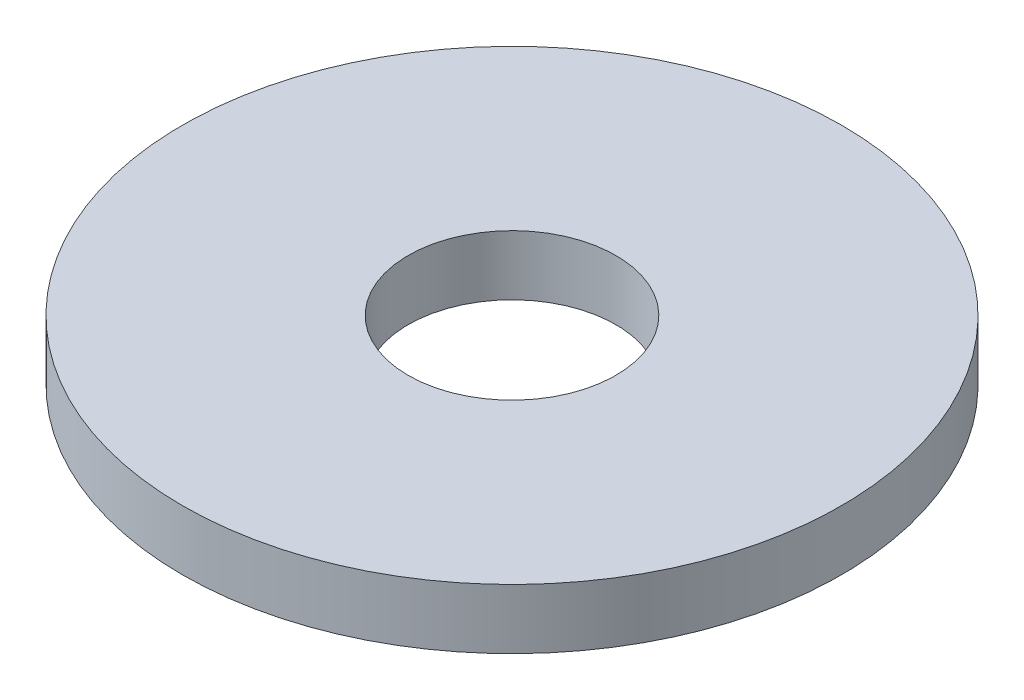
ISO-10303-21;
HEADER;
FILE_DESCRIPTION(('STEP AP214'),'2;1');
FILE_NAME('part.step','',(''),(''),'','','');
FILE_SCHEMA(('AUTOMOTIVE_DESIGN { 1 0 10303 214 1 1 1 1 }'));
ENDSEC;
DATA;
#1=APPLICATION_CONTEXT('core data for automotive mechanical design processes');
#2=APPLICATION_PROTOCOL_DEFINITION('international standard','automotive_design',2000,#1);
#3=PRODUCT_CONTEXT('',#1,'mechanical');
#4=PRODUCT('Part','Part','',(#3));
#5=PRODUCT_RELATED_PRODUCT_CATEGORY('part','',(#4));
#6=PRODUCT_DEFINITION_FORMATION('','',#4);
#7=PRODUCT_DEFINITION_CONTEXT('part definition',#1,'design');
#8=PRODUCT_DEFINITION('design','',#6,#7);
#9=PRODUCT_DEFINITION_SHAPE('','',#8);
#10=(LENGTH_UNIT() NAMED_UNIT(*) SI_UNIT(.MILLI.,.METRE.));
#11=(NAMED_UNIT(*) PLANE_ANGLE_UNIT() SI_UNIT($,.RADIAN.));
#12=(NAMED_UNIT(*) SI_UNIT($,.STERADIAN.) SOLID_ANGLE_UNIT());
#13=UNCERTAINTY_MEASURE_WITH_UNIT(LENGTH_MEASURE(1.E-05),#10,'distance_accuracy_value','');
#14=(GEOMETRIC_REPRESENTATION_CONTEXT(3) GLOBAL_UNCERTAINTY_ASSIGNED_CONTEXT((#13)) GLOBAL_UNIT_ASSIGNED_CONTEXT((#10,
#11,#12)) REPRESENTATION_CONTEXT('',''));
#15=CARTESIAN_POINT('',(0.,0.,0.));
#16=DIRECTION('',(0.,0.,1.));
#17=DIRECTION('',(1.,0.,0.));
#18=AXIS2_PLACEMENT_3D('',#15,#16,#17);
#19=CARTESIAN_POINT('',(0.,1.5,0.));
#20=DIRECTION('',(0.,1.,0.));
#21=DIRECTION('',(0.,0.,1.));
#22=AXIS2_PLACEMENT_3D('',#19,#20,#21);
#23=PLANE('',#22);
#24=CARTESIAN_POINT('',(0.,1.5,0.));
#25=DIRECTION('',(0.,1.,0.));
#26=DIRECTION('',(0.,0.,1.));
#27=AXIS2_PLACEMENT_3D('',#24,#25,#26);
#28=CIRCLE('',#27,8.25);
#29=CARTESIAN_POINT('',(0.,1.5,8.25));
#30=VERTEX_POINT('',#29);
#31=EDGE_CURVE('E11',#30,#30,#28,.T.);
#32=ORIENTED_EDGE('',*,*,#31,.T.);
#33=EDGE_LOOP('',(#32));
#34=FACE_BOUND('',#33,.T.);
#35=CARTESIAN_POINT('',(0.,1.5,0.));
#36=DIRECTION('',(0.,1.,0.));
#37=DIRECTION('',(0.,0.,1.));
#38=AXIS2_PLACEMENT_3D('',#35,#36,#37);
#39=CIRCLE('',#38,2.6);
#40=CARTESIAN_POINT('',(0.,1.5,2.6));
#41=VERTEX_POINT('',#40);
#42=EDGE_CURVE('E56',#41,#41,#39,.T.);
#43=ORIENTED_EDGE('',*,*,#42,.F.);
#44=EDGE_LOOP('',(#43));
#45=FACE_BOUND('',#44,.T.);
#46=ADVANCED_FACE('F43',(#34,#45),#23,.T.);
#47=CARTESIAN_POINT('',(0.,0.,0.));
#48=DIRECTION('',(0.,1.,0.));
#49=DIRECTION('',(0.,0.,1.));
#50=AXIS2_PLACEMENT_3D('',#47,#48,#49);
#51=PLANE('',#50);
#52=CARTESIAN_POINT('',(0.,0.,0.));
#53=DIRECTION('',(0.,1.,0.));
#54=DIRECTION('',(0.,0.,1.));
#55=AXIS2_PLACEMENT_3D('',#52,#53,#54);
#56=CIRCLE('',#55,8.25);
#57=CARTESIAN_POINT('',(0.,0.,8.25));
#58=VERTEX_POINT('',#57);
#59=EDGE_CURVE('E47',#58,#58,#56,.T.);
#60=ORIENTED_EDGE('',*,*,#59,.F.);
#61=EDGE_LOOP('',(#60));
#62=FACE_BOUND('',#61,.T.);
#63=CARTESIAN_POINT('',(0.,0.,0.));
#64=DIRECTION('',(0.,1.,0.));
#65=DIRECTION('',(0.,0.,1.));
#66=AXIS2_PLACEMENT_3D('',#63,#64,#65);
#67=CIRCLE('',#66,2.6);
#68=CARTESIAN_POINT('',(0.,0.,2.6));
#69=VERTEX_POINT('',#68);
#70=EDGE_CURVE('E58',#69,#69,#67,.T.);
#71=ORIENTED_EDGE('',*,*,#70,.T.);
#72=EDGE_LOOP('',(#71));
#73=FACE_BOUND('',#72,.T.);
#74=ADVANCED_FACE('F70',(#62,#73),#51,.F.);
#75=CARTESIAN_POINT('',(0.,1.5,0.));
#76=DIRECTION('',(0.,-1.,0.));
#77=DIRECTION('',(0.,0.,-1.));
#78=AXIS2_PLACEMENT_3D('',#75,#76,#77);
#79=CYLINDRICAL_SURFACE('',#78,8.25);
#80=ORIENTED_EDGE('',*,*,#31,.F.);
#81=EDGE_LOOP('',(#80));
#82=FACE_BOUND('',#81,.T.);
#83=ORIENTED_EDGE('',*,*,#59,.T.);
#84=EDGE_LOOP('',(#83));
#85=FACE_BOUND('',#84,.T.);
#86=ADVANCED_FACE('F45',(#82,#85),#79,.T.);
#87=CARTESIAN_POINT('',(0.,1.5,0.));
#88=DIRECTION('',(0.,-1.,0.));
#89=DIRECTION('',(0.,0.,-1.));
#90=AXIS2_PLACEMENT_3D('',#87,#88,#89);
#91=CYLINDRICAL_SURFACE('',#90,2.6);
#92=ORIENTED_EDGE('',*,*,#42,.T.);
#93=EDGE_LOOP('',(#92));
#94=FACE_BOUND('',#93,.T.);
#95=ORIENTED_EDGE('',*,*,#70,.F.);
#96=EDGE_LOOP('',(#95));
#97=FACE_BOUND('',#96,.T.);
#98=ADVANCED_FACE('F66',(#94,#97),#91,.F.);
#99=CLOSED_SHELL('',(#46,#74,#86,#98));
#100=MANIFOLD_SOLID_BREP('B2',#99);
#101=ADVANCED_BREP_SHAPE_REPRESENTATION('',(#18,#100),#14);
#102=SHAPE_DEFINITION_REPRESENTATION(#9,#101);
ENDSEC;
END-ISO-10303-21;
